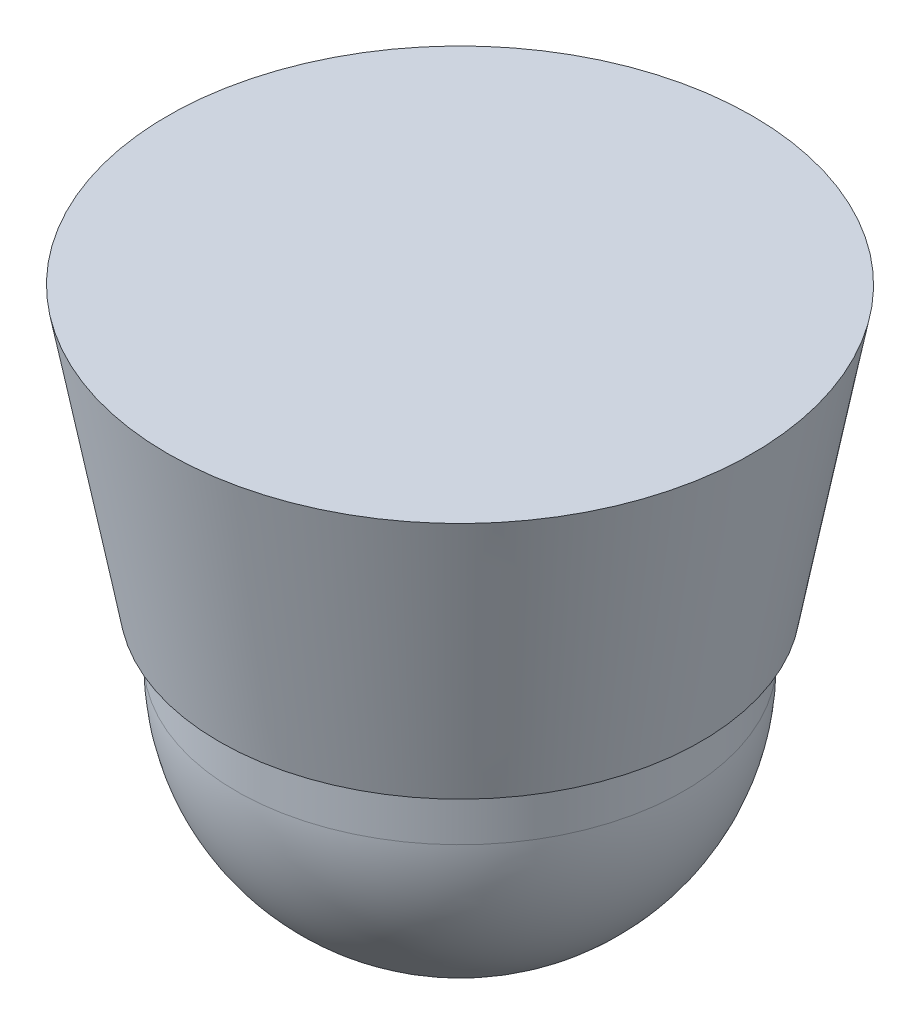
ISO-10303-21;
HEADER;
FILE_DESCRIPTION(('STEP AP214'),'2;1');
FILE_NAME('part.step','',(''),(''),'','','');
FILE_SCHEMA(('AUTOMOTIVE_DESIGN { 1 0 10303 214 1 1 1 1 }'));
ENDSEC;
DATA;
#1=APPLICATION_CONTEXT('core data for automotive mechanical design processes');
#2=APPLICATION_PROTOCOL_DEFINITION('international standard','automotive_design',2000,#1);
#3=PRODUCT_CONTEXT('',#1,'mechanical');
#4=PRODUCT('Part','Part','',(#3));
#5=PRODUCT_RELATED_PRODUCT_CATEGORY('part','',(#4));
#6=PRODUCT_DEFINITION_FORMATION('','',#4);
#7=PRODUCT_DEFINITION_CONTEXT('part definition',#1,'design');
#8=PRODUCT_DEFINITION('design','',#6,#7);
#9=PRODUCT_DEFINITION_SHAPE('','',#8);
#10=(LENGTH_UNIT() NAMED_UNIT(*) SI_UNIT(.MILLI.,.METRE.));
#11=(NAMED_UNIT(*) PLANE_ANGLE_UNIT() SI_UNIT($,.RADIAN.));
#12=(NAMED_UNIT(*) SI_UNIT($,.STERADIAN.) SOLID_ANGLE_UNIT());
#13=UNCERTAINTY_MEASURE_WITH_UNIT(LENGTH_MEASURE(1.E-05),#10,'distance_accuracy_value','');
#14=(GEOMETRIC_REPRESENTATION_CONTEXT(3) GLOBAL_UNCERTAINTY_ASSIGNED_CONTEXT((#13)) GLOBAL_UNIT_ASSIGNED_CONTEXT((#10,
#11,#12)) REPRESENTATION_CONTEXT('',''));
#15=CARTESIAN_POINT('',(0.,0.,0.));
#16=DIRECTION('',(0.,0.,1.));
#17=DIRECTION('',(1.,0.,0.));
#18=AXIS2_PLACEMENT_3D('',#15,#16,#17);
#19=CARTESIAN_POINT('',(0.,0.,0.));
#20=DIRECTION('',(0.,1.,0.));
#21=DIRECTION('',(0.,0.,1.));
#22=AXIS2_PLACEMENT_3D('',#19,#20,#21);
#23=PLANE('',#22);
#24=CARTESIAN_POINT('',(0.,0.,0.));
#25=DIRECTION('',(0.,1.,0.));
#26=DIRECTION('',(0.,0.,1.));
#27=AXIS2_PLACEMENT_3D('',#24,#25,#26);
#28=CIRCLE('',#27,85.);
#29=CARTESIAN_POINT('',(0.,0.,85.));
#30=VERTEX_POINT('',#29);
#31=EDGE_CURVE('E11',#30,#30,#28,.T.);
#32=ORIENTED_EDGE('',*,*,#31,.T.);
#33=EDGE_LOOP('',(#32));
#34=FACE_BOUND('',#33,.T.);
#35=ADVANCED_FACE('F47',(#34),#23,.T.);
#36=CARTESIAN_POINT('',(0.,0.,0.));
#37=DIRECTION('',(0.,1.,0.));
#38=DIRECTION('',(0.,0.,1.));
#39=AXIS2_PLACEMENT_3D('',#36,#37,#38);
#40=CONICAL_SURFACE('',#39,85.,0.185347949995695);
#41=CARTESIAN_POINT('',(0.,-80.,0.));
#42=DIRECTION('',(0.,1.,0.));
#43=DIRECTION('',(0.,0.,1.));
#44=AXIS2_PLACEMENT_3D('',#41,#42,#43);
#45=CIRCLE('',#44,70.);
#46=CARTESIAN_POINT('',(0.,-80.,70.));
#47=VERTEX_POINT('',#46);
#48=EDGE_CURVE('E54',#47,#47,#45,.T.);
#49=ORIENTED_EDGE('',*,*,#48,.T.);
#50=EDGE_LOOP('',(#49));
#51=FACE_BOUND('',#50,.T.);
#52=ORIENTED_EDGE('',*,*,#31,.F.);
#53=EDGE_LOOP('',(#52));
#54=FACE_BOUND('',#53,.T.);
#55=ADVANCED_FACE('F76',(#51,#54),#40,.T.);
#56=CARTESIAN_POINT('',(0.,-80.,0.));
#57=DIRECTION('',(0.,1.,0.));
#58=DIRECTION('',(0.,0.,1.));
#59=AXIS2_PLACEMENT_3D('',#56,#57,#58);
#60=PLANE('',#59);
#61=CARTESIAN_POINT('',(0.,-80.,0.));
#62=DIRECTION('',(0.,1.,0.));
#63=DIRECTION('',(-1.,0.,0.));
#64=AXIS2_PLACEMENT_3D('',#61,#62,#63);
#65=CIRCLE('',#64,65.);
#66=CARTESIAN_POINT('',(-65.,-80.,0.));
#67=VERTEX_POINT('',#66);
#68=EDGE_CURVE('E67',#67,#67,#65,.T.);
#69=ORIENTED_EDGE('',*,*,#68,.T.);
#70=EDGE_LOOP('',(#69));
#71=FACE_BOUND('',#70,.T.);
#72=ORIENTED_EDGE('',*,*,#48,.F.);
#73=EDGE_LOOP('',(#72));
#74=FACE_BOUND('',#73,.T.);
#75=ADVANCED_FACE('F79',(#71,#74),#60,.F.);
#76=CARTESIAN_POINT('',(0.,159.59199221097,0.));
#77=DIRECTION('',(0.,1.,0.));
#78=DIRECTION('',(-1.,0.,0.));
#79=AXIS2_PLACEMENT_3D('',#76,#77,#78);
#80=CYLINDRICAL_SURFACE('',#79,65.);
#81=CARTESIAN_POINT('',(0.,-95.0000000000001,0.));
#82=DIRECTION('',(0.,1.,0.));
#83=DIRECTION('',(-1.,0.,0.));
#84=AXIS2_PLACEMENT_3D('',#81,#82,#83);
#85=CIRCLE('',#84,65.);
#86=CARTESIAN_POINT('',(-65.,-95.0000000000001,0.));
#87=VERTEX_POINT('',#86);
#88=EDGE_CURVE('E64',#87,#87,#85,.T.);
#89=ORIENTED_EDGE('',*,*,#88,.T.);
#90=EDGE_LOOP('',(#89));
#91=FACE_BOUND('',#90,.T.);
#92=ORIENTED_EDGE('',*,*,#68,.F.);
#93=EDGE_LOOP('',(#92));
#94=FACE_BOUND('',#93,.T.);
#95=ADVANCED_FACE('F60',(#91,#94),#80,.T.);
#96=CARTESIAN_POINT('',(-0.153522419875041,-95.,0.));
#97=DIRECTION('',(0.,0.,-1.));
#98=DIRECTION('',(-1.,0.,0.));
#99=AXIS2_PLACEMENT_3D('',#96,#97,#98);
#100=CIRCLE('',#99,64.8464775801249);
#101=TRIMMED_CURVE('',#100,(PARAMETER_VALUE(-1.57316380408924)),
(PARAMETER_VALUE(1.57316380408924)),.T.,.PARAMETER.);
#102=CARTESIAN_POINT('',(0.,-95.,0.));
#103=DIRECTION('',(0.,1.,0.));
#104=AXIS1_PLACEMENT('',#102,#103);
#105=SURFACE_OF_REVOLUTION('',#101,#104);
#106=CARTESIAN_POINT('',(0.,-159.846295849618,0.));
#107=VERTEX_POINT('',#106);
#108=VERTEX_LOOP('',#107);
#109=FACE_BOUND('',#108,.T.);
#110=ORIENTED_EDGE('',*,*,#88,.F.);
#111=EDGE_LOOP('',(#110));
#112=FACE_BOUND('',#111,.T.);
#113=ADVANCED_FACE('F57',(#109,#112),#105,.T.);
#114=CLOSED_SHELL('',(#35,#55,#75,#95,#113));
#115=MANIFOLD_SOLID_BREP('B2',#114);
#116=ADVANCED_BREP_SHAPE_REPRESENTATION('',(#18,#115),#14);
#117=SHAPE_DEFINITION_REPRESENTATION(#9,#116);
ENDSEC;
END-ISO-10303-21;
